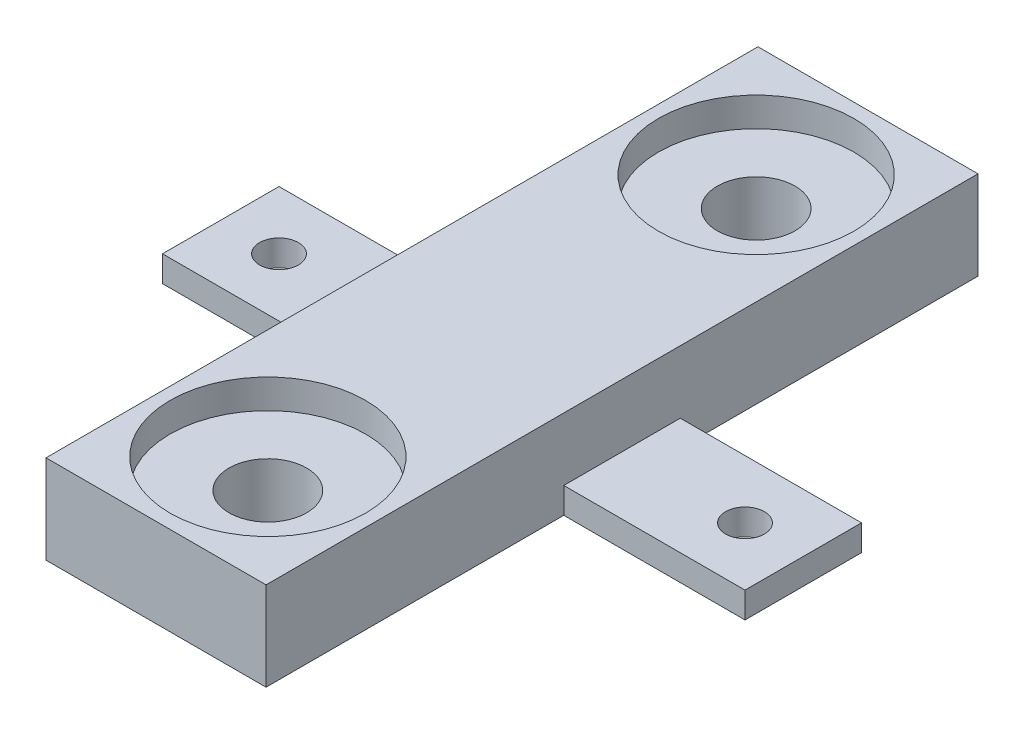
ISO-10303-21;
HEADER;
FILE_DESCRIPTION(('STEP AP214'),'2;1');
FILE_NAME('part.step','',(''),(''),'','','');
FILE_SCHEMA(('AUTOMOTIVE_DESIGN { 1 0 10303 214 1 1 1 1 }'));
ENDSEC;
DATA;
#1=APPLICATION_CONTEXT('core data for automotive mechanical design processes');
#2=APPLICATION_PROTOCOL_DEFINITION('international standard','automotive_design',2000,#1);
#3=PRODUCT_CONTEXT('',#1,'mechanical');
#4=PRODUCT('Part','Part','',(#3));
#5=PRODUCT_RELATED_PRODUCT_CATEGORY('part','',(#4));
#6=PRODUCT_DEFINITION_FORMATION('','',#4);
#7=PRODUCT_DEFINITION_CONTEXT('part definition',#1,'design');
#8=PRODUCT_DEFINITION('design','',#6,#7);
#9=PRODUCT_DEFINITION_SHAPE('','',#8);
#10=(LENGTH_UNIT() NAMED_UNIT(*) SI_UNIT(.MILLI.,.METRE.));
#11=(NAMED_UNIT(*) PLANE_ANGLE_UNIT() SI_UNIT($,.RADIAN.));
#12=(NAMED_UNIT(*) SI_UNIT($,.STERADIAN.) SOLID_ANGLE_UNIT());
#13=UNCERTAINTY_MEASURE_WITH_UNIT(LENGTH_MEASURE(1.E-05),#10,'distance_accuracy_value','');
#14=(GEOMETRIC_REPRESENTATION_CONTEXT(3) GLOBAL_UNCERTAINTY_ASSIGNED_CONTEXT((#13)) GLOBAL_UNIT_ASSIGNED_CONTEXT((#10,
#11,#12)) REPRESENTATION_CONTEXT('',''));
#15=CARTESIAN_POINT('',(0.,0.,0.));
#16=DIRECTION('',(0.,0.,1.));
#17=DIRECTION('',(1.,0.,0.));
#18=AXIS2_PLACEMENT_3D('',#15,#16,#17);
#19=CARTESIAN_POINT('',(0.,2.,0.));
#20=DIRECTION('',(0.,1.,0.));
#21=DIRECTION('',(0.,0.,1.));
#22=AXIS2_PLACEMENT_3D('',#19,#20,#21);
#23=PLANE('',#22);
#24=CARTESIAN_POINT('',(-18.,2.,0.));
#25=DIRECTION('',(0.,1.,0.));
#26=DIRECTION('',(0.,0.,1.));
#27=AXIS2_PLACEMENT_3D('',#24,#25,#26);
#28=CIRCLE('',#27,1.5);
#29=CARTESIAN_POINT('',(-18.,2.,1.5));
#30=VERTEX_POINT('',#29);
#31=EDGE_CURVE('E169',#30,#30,#28,.T.);
#32=ORIENTED_EDGE('',*,*,#31,.F.);
#33=EDGE_LOOP('',(#32));
#34=FACE_BOUND('',#33,.T.);
#35=DIRECTION('',(-1.,0.,0.));
#36=VECTOR('',#35,1.);
#37=CARTESIAN_POINT('',(0.,2.,4.49999999999999));
#38=LINE('',#37,#36);
#39=CARTESIAN_POINT('',(-8.5,2.,4.5));
#40=VERTEX_POINT('',#39);
#41=CARTESIAN_POINT('',(-22.5,2.,4.5));
#42=VERTEX_POINT('',#41);
#43=EDGE_CURVE('E155',#40,#42,#38,.T.);
#44=ORIENTED_EDGE('',*,*,#43,.F.);
#45=DIRECTION('',(0.,0.,-1.));
#46=VECTOR('',#45,1.);
#47=CARTESIAN_POINT('',(-8.5,2.,0.));
#48=LINE('',#47,#46);
#49=CARTESIAN_POINT('',(-8.5,2.,-4.5));
#50=VERTEX_POINT('',#49);
#51=EDGE_CURVE('E255',#40,#50,#48,.T.);
#52=ORIENTED_EDGE('',*,*,#51,.T.);
#53=DIRECTION('',(-1.,0.,0.));
#54=VECTOR('',#53,1.);
#55=CARTESIAN_POINT('',(0.,2.,-4.49999999999999));
#56=LINE('',#55,#54);
#57=CARTESIAN_POINT('',(-22.5,2.,-4.5));
#58=VERTEX_POINT('',#57);
#59=EDGE_CURVE('E138',#50,#58,#56,.T.);
#60=ORIENTED_EDGE('',*,*,#59,.T.);
#61=DIRECTION('',(0.,0.,1.));
#62=VECTOR('',#61,1.);
#63=CARTESIAN_POINT('',(-22.5,2.,0.));
#64=LINE('',#63,#62);
#65=EDGE_CURVE('E269',#58,#42,#64,.T.);
#66=ORIENTED_EDGE('',*,*,#65,.T.);
#67=EDGE_LOOP('',(#44,#52,#60,#66));
#68=FACE_BOUND('',#67,.T.);
#69=ADVANCED_FACE('F64',(#34,#68),#23,.T.);
#70=CARTESIAN_POINT('',(0.,2.,-27.5));
#71=DIRECTION('',(0.,0.,-1.));
#72=DIRECTION('',(-1.,0.,0.));
#73=AXIS2_PLACEMENT_3D('',#70,#71,#72);
#74=PLANE('',#73);
#75=DIRECTION('',(1.,0.,0.));
#76=VECTOR('',#75,1.);
#77=CARTESIAN_POINT('',(0.,0.,-27.5));
#78=LINE('',#77,#76);
#79=CARTESIAN_POINT('',(-8.5,0.,-27.5));
#80=VERTEX_POINT('',#79);
#81=CARTESIAN_POINT('',(8.5,0.,-27.5));
#82=VERTEX_POINT('',#81);
#83=EDGE_CURVE('E180',#80,#82,#78,.T.);
#84=ORIENTED_EDGE('',*,*,#83,.F.);
#85=DIRECTION('',(0.,-1.,0.));
#86=VECTOR('',#85,1.);
#87=CARTESIAN_POINT('',(-8.5,2.,-27.5));
#88=LINE('',#87,#86);
#89=CARTESIAN_POINT('',(-8.5,6.85,-27.5));
#90=VERTEX_POINT('',#89);
#91=EDGE_CURVE('E229',#90,#80,#88,.T.);
#92=ORIENTED_EDGE('',*,*,#91,.F.);
#93=DIRECTION('',(1.,0.,0.));
#94=VECTOR('',#93,1.);
#95=CARTESIAN_POINT('',(0.,6.85,-27.5));
#96=LINE('',#95,#94);
#97=CARTESIAN_POINT('',(8.5,6.85,-27.5));
#98=VERTEX_POINT('',#97);
#99=EDGE_CURVE('E261',#90,#98,#96,.T.);
#100=ORIENTED_EDGE('',*,*,#99,.T.);
#101=DIRECTION('',(0.,-1.,0.));
#102=VECTOR('',#101,1.);
#103=CARTESIAN_POINT('',(8.5,2.,-27.5));
#104=LINE('',#103,#102);
#105=EDGE_CURVE('E231',#98,#82,#104,.T.);
#106=ORIENTED_EDGE('',*,*,#105,.T.);
#107=EDGE_LOOP('',(#84,#92,#100,#106));
#108=FACE_BOUND('',#107,.T.);
#109=ADVANCED_FACE('F66',(#108),#74,.T.);
#110=CARTESIAN_POINT('',(0.,2.,-4.49999999999999));
#111=DIRECTION('',(0.,0.,1.));
#112=DIRECTION('',(1.,0.,0.));
#113=AXIS2_PLACEMENT_3D('',#110,#111,#112);
#114=PLANE('',#113);
#115=DIRECTION('',(-1.,0.,0.));
#116=VECTOR('',#115,1.);
#117=CARTESIAN_POINT('',(0.,0.,-4.49999999999999));
#118=LINE('',#117,#116);
#119=CARTESIAN_POINT('',(-8.5,0.,-4.5));
#120=VERTEX_POINT('',#119);
#121=CARTESIAN_POINT('',(-22.5,0.,-4.5));
#122=VERTEX_POINT('',#121);
#123=EDGE_CURVE('E187',#120,#122,#118,.T.);
#124=ORIENTED_EDGE('',*,*,#123,.T.);
#125=DIRECTION('',(0.,-1.,0.));
#126=VECTOR('',#125,1.);
#127=CARTESIAN_POINT('',(-22.5,2.,-4.5));
#128=LINE('',#127,#126);
#129=EDGE_CURVE('E223',#58,#122,#128,.T.);
#130=ORIENTED_EDGE('',*,*,#129,.F.);
#131=ORIENTED_EDGE('',*,*,#59,.F.);
#132=DIRECTION('',(0.,-1.,0.));
#133=VECTOR('',#132,1.);
#134=CARTESIAN_POINT('',(-8.5,2.,-4.5));
#135=LINE('',#134,#133);
#136=EDGE_CURVE('E226',#50,#120,#135,.T.);
#137=ORIENTED_EDGE('',*,*,#136,.T.);
#138=EDGE_LOOP('',(#124,#130,#131,#137));
#139=FACE_BOUND('',#138,.T.);
#140=ADVANCED_FACE('F336',(#139),#114,.F.);
#141=CARTESIAN_POINT('',(-22.5,2.,0.));
#142=DIRECTION('',(1.,0.,0.));
#143=DIRECTION('',(0.,0.,-1.));
#144=AXIS2_PLACEMENT_3D('',#141,#142,#143);
#145=PLANE('',#144);
#146=DIRECTION('',(0.,0.,1.));
#147=VECTOR('',#146,1.);
#148=CARTESIAN_POINT('',(-22.5,0.,0.));
#149=LINE('',#148,#147);
#150=CARTESIAN_POINT('',(-22.5,0.,4.5));
#151=VERTEX_POINT('',#150);
#152=EDGE_CURVE('E190',#122,#151,#149,.T.);
#153=ORIENTED_EDGE('',*,*,#152,.T.);
#154=DIRECTION('',(0.,-1.,0.));
#155=VECTOR('',#154,1.);
#156=CARTESIAN_POINT('',(-22.5,2.,4.5));
#157=LINE('',#156,#155);
#158=EDGE_CURVE('E221',#42,#151,#157,.T.);
#159=ORIENTED_EDGE('',*,*,#158,.F.);
#160=ORIENTED_EDGE('',*,*,#65,.F.);
#161=ORIENTED_EDGE('',*,*,#129,.T.);
#162=EDGE_LOOP('',(#153,#159,#160,#161));
#163=FACE_BOUND('',#162,.T.);
#164=ADVANCED_FACE('F490',(#163),#145,.F.);
#165=CARTESIAN_POINT('',(0.,2.,4.49999999999999));
#166=DIRECTION('',(0.,0.,1.));
#167=DIRECTION('',(1.,0.,0.));
#168=AXIS2_PLACEMENT_3D('',#165,#166,#167);
#169=PLANE('',#168);
#170=DIRECTION('',(-1.,0.,0.));
#171=VECTOR('',#170,1.);
#172=CARTESIAN_POINT('',(0.,0.,4.49999999999999));
#173=LINE('',#172,#171);
#174=CARTESIAN_POINT('',(-8.5,0.,4.49999999999999));
#175=VERTEX_POINT('',#174);
#176=EDGE_CURVE('E193',#175,#151,#173,.T.);
#177=ORIENTED_EDGE('',*,*,#176,.F.);
#178=DIRECTION('',(0.,-1.,0.));
#179=VECTOR('',#178,1.);
#180=CARTESIAN_POINT('',(-8.5,2.,4.49999999999999));
#181=LINE('',#180,#179);
#182=EDGE_CURVE('E219',#40,#175,#181,.T.);
#183=ORIENTED_EDGE('',*,*,#182,.F.);
#184=ORIENTED_EDGE('',*,*,#43,.T.);
#185=ORIENTED_EDGE('',*,*,#158,.T.);
#186=EDGE_LOOP('',(#177,#183,#184,#185));
#187=FACE_BOUND('',#186,.T.);
#188=ADVANCED_FACE('F275',(#187),#169,.T.);
#189=CARTESIAN_POINT('',(-8.5,2.,0.));
#190=DIRECTION('',(1.,0.,0.));
#191=DIRECTION('',(0.,0.,-1.));
#192=AXIS2_PLACEMENT_3D('',#189,#190,#191);
#193=PLANE('',#192);
#194=DIRECTION('',(0.,0.,1.));
#195=VECTOR('',#194,1.);
#196=CARTESIAN_POINT('',(-8.5,0.,0.));
#197=LINE('',#196,#195);
#198=CARTESIAN_POINT('',(-8.49999999999999,0.,27.5));
#199=VERTEX_POINT('',#198);
#200=EDGE_CURVE('E188',#175,#199,#197,.T.);
#201=ORIENTED_EDGE('',*,*,#200,.T.);
#202=DIRECTION('',(0.,-1.,0.));
#203=VECTOR('',#202,1.);
#204=CARTESIAN_POINT('',(-8.49999999999999,2.,27.5));
#205=LINE('',#204,#203);
#206=CARTESIAN_POINT('',(-8.49999999999999,6.85,27.5));
#207=VERTEX_POINT('',#206);
#208=EDGE_CURVE('E216',#207,#199,#205,.T.);
#209=ORIENTED_EDGE('',*,*,#208,.F.);
#210=DIRECTION('',(0.,0.,1.));
#211=VECTOR('',#210,1.);
#212=CARTESIAN_POINT('',(-8.5,6.85,0.));
#213=LINE('',#212,#211);
#214=EDGE_CURVE('E181',#90,#207,#213,.T.);
#215=ORIENTED_EDGE('',*,*,#214,.F.);
#216=ORIENTED_EDGE('',*,*,#91,.T.);
#217=EDGE_CURVE('E185',#80,#120,#197,.T.);
#218=ORIENTED_EDGE('',*,*,#217,.T.);
#219=ORIENTED_EDGE('',*,*,#136,.F.);
#220=ORIENTED_EDGE('',*,*,#51,.F.);
#221=ORIENTED_EDGE('',*,*,#182,.T.);
#222=EDGE_LOOP('',(#201,#209,#215,#216,#218,#219,#220,#221));
#223=FACE_BOUND('',#222,.T.);
#224=ADVANCED_FACE('F311',(#223),#193,.F.);
#225=CARTESIAN_POINT('',(0.,2.,27.5));
#226=DIRECTION('',(0.,0.,-1.));
#227=DIRECTION('',(-1.,0.,0.));
#228=AXIS2_PLACEMENT_3D('',#225,#226,#227);
#229=PLANE('',#228);
#230=DIRECTION('',(1.,0.,0.));
#231=VECTOR('',#230,1.);
#232=CARTESIAN_POINT('',(0.,0.,27.5));
#233=LINE('',#232,#231);
#234=CARTESIAN_POINT('',(8.5,0.,27.5));
#235=VERTEX_POINT('',#234);
#236=EDGE_CURVE('E196',#199,#235,#233,.T.);
#237=ORIENTED_EDGE('',*,*,#236,.T.);
#238=DIRECTION('',(0.,-1.,0.));
#239=VECTOR('',#238,1.);
#240=CARTESIAN_POINT('',(8.5,2.,27.5));
#241=LINE('',#240,#239);
#242=CARTESIAN_POINT('',(8.5,6.85,27.5));
#243=VERTEX_POINT('',#242);
#244=EDGE_CURVE('E214',#243,#235,#241,.T.);
#245=ORIENTED_EDGE('',*,*,#244,.F.);
#246=DIRECTION('',(1.,0.,0.));
#247=VECTOR('',#246,1.);
#248=CARTESIAN_POINT('',(0.,6.85,27.5));
#249=LINE('',#248,#247);
#250=EDGE_CURVE('E252',#207,#243,#249,.T.);
#251=ORIENTED_EDGE('',*,*,#250,.F.);
#252=ORIENTED_EDGE('',*,*,#208,.T.);
#253=EDGE_LOOP('',(#237,#245,#251,#252));
#254=FACE_BOUND('',#253,.T.);
#255=ADVANCED_FACE('F298',(#254),#229,.F.);
#256=CARTESIAN_POINT('',(8.5,2.,0.));
#257=DIRECTION('',(1.,0.,0.));
#258=DIRECTION('',(0.,0.,-1.));
#259=AXIS2_PLACEMENT_3D('',#256,#257,#258);
#260=PLANE('',#259);
#261=DIRECTION('',(0.,0.,1.));
#262=VECTOR('',#261,1.);
#263=CARTESIAN_POINT('',(8.5,0.,0.));
#264=LINE('',#263,#262);
#265=CARTESIAN_POINT('',(8.5,0.,4.5));
#266=VERTEX_POINT('',#265);
#267=EDGE_CURVE('E182',#266,#235,#264,.T.);
#268=ORIENTED_EDGE('',*,*,#267,.F.);
#269=DIRECTION('',(0.,-1.,0.));
#270=VECTOR('',#269,1.);
#271=CARTESIAN_POINT('',(8.5,2.,4.5));
#272=LINE('',#271,#270);
#273=CARTESIAN_POINT('',(8.5,2.,4.49999999999999));
#274=VERTEX_POINT('',#273);
#275=EDGE_CURVE('E164',#274,#266,#272,.T.);
#276=ORIENTED_EDGE('',*,*,#275,.F.);
#277=DIRECTION('',(0.,0.,-1.));
#278=VECTOR('',#277,1.);
#279=CARTESIAN_POINT('',(8.5,2.,0.));
#280=LINE('',#279,#278);
#281=CARTESIAN_POINT('',(8.5,2.,-4.5));
#282=VERTEX_POINT('',#281);
#283=EDGE_CURVE('E83',#274,#282,#280,.T.);
#284=ORIENTED_EDGE('',*,*,#283,.T.);
#285=DIRECTION('',(0.,-1.,0.));
#286=VECTOR('',#285,1.);
#287=CARTESIAN_POINT('',(8.5,2.,-4.5));
#288=LINE('',#287,#286);
#289=CARTESIAN_POINT('',(8.5,0.,-4.5));
#290=VERTEX_POINT('',#289);
#291=EDGE_CURVE('E129',#282,#290,#288,.T.);
#292=ORIENTED_EDGE('',*,*,#291,.T.);
#293=EDGE_CURVE('E178',#82,#290,#264,.T.);
#294=ORIENTED_EDGE('',*,*,#293,.F.);
#295=ORIENTED_EDGE('',*,*,#105,.F.);
#296=DIRECTION('',(0.,0.,1.));
#297=VECTOR('',#296,1.);
#298=CARTESIAN_POINT('',(8.5,6.85,0.));
#299=LINE('',#298,#297);
#300=EDGE_CURVE('E258',#98,#243,#299,.T.);
#301=ORIENTED_EDGE('',*,*,#300,.T.);
#302=ORIENTED_EDGE('',*,*,#244,.T.);
#303=EDGE_LOOP('',(#268,#276,#284,#292,#294,#295,#301,#302));
#304=FACE_BOUND('',#303,.T.);
#305=ADVANCED_FACE('F307',(#304),#260,.T.);
#306=CARTESIAN_POINT('',(0.,2.,4.5));
#307=DIRECTION('',(0.,0.,-1.));
#308=DIRECTION('',(-1.,0.,0.));
#309=AXIS2_PLACEMENT_3D('',#306,#307,#308);
#310=PLANE('',#309);
#311=DIRECTION('',(1.,0.,0.));
#312=VECTOR('',#311,1.);
#313=CARTESIAN_POINT('',(0.,0.,4.5));
#314=LINE('',#313,#312);
#315=CARTESIAN_POINT('',(22.5,0.,4.49999999999999));
#316=VERTEX_POINT('',#315);
#317=EDGE_CURVE('E161',#266,#316,#314,.T.);
#318=ORIENTED_EDGE('',*,*,#317,.T.);
#319=DIRECTION('',(0.,-1.,0.));
#320=VECTOR('',#319,1.);
#321=CARTESIAN_POINT('',(22.5,2.,4.49999999999999));
#322=LINE('',#321,#320);
#323=CARTESIAN_POINT('',(22.5,2.,4.49999999999999));
#324=VERTEX_POINT('',#323);
#325=EDGE_CURVE('E158',#324,#316,#322,.T.);
#326=ORIENTED_EDGE('',*,*,#325,.F.);
#327=DIRECTION('',(1.,0.,0.));
#328=VECTOR('',#327,1.);
#329=CARTESIAN_POINT('',(0.,2.,4.5));
#330=LINE('',#329,#328);
#331=EDGE_CURVE('E147',#274,#324,#330,.T.);
#332=ORIENTED_EDGE('',*,*,#331,.F.);
#333=ORIENTED_EDGE('',*,*,#275,.T.);
#334=EDGE_LOOP('',(#318,#326,#332,#333));
#335=FACE_BOUND('',#334,.T.);
#336=ADVANCED_FACE('F159',(#335),#310,.F.);
#337=CARTESIAN_POINT('',(22.5,2.,0.));
#338=DIRECTION('',(1.,0.,0.));
#339=DIRECTION('',(0.,0.,-1.));
#340=AXIS2_PLACEMENT_3D('',#337,#338,#339);
#341=PLANE('',#340);
#342=DIRECTION('',(0.,0.,1.));
#343=VECTOR('',#342,1.);
#344=CARTESIAN_POINT('',(22.5,0.,0.));
#345=LINE('',#344,#343);
#346=CARTESIAN_POINT('',(22.5,0.,-4.50000000000001));
#347=VERTEX_POINT('',#346);
#348=EDGE_CURVE('E200',#347,#316,#345,.T.);
#349=ORIENTED_EDGE('',*,*,#348,.F.);
#350=DIRECTION('',(0.,-1.,0.));
#351=VECTOR('',#350,1.);
#352=CARTESIAN_POINT('',(22.5,2.,-4.50000000000001));
#353=LINE('',#352,#351);
#354=CARTESIAN_POINT('',(22.5,2.,-4.50000000000001));
#355=VERTEX_POINT('',#354);
#356=EDGE_CURVE('E125',#355,#347,#353,.T.);
#357=ORIENTED_EDGE('',*,*,#356,.F.);
#358=DIRECTION('',(0.,0.,1.));
#359=VECTOR('',#358,1.);
#360=CARTESIAN_POINT('',(22.5,2.,0.));
#361=LINE('',#360,#359);
#362=EDGE_CURVE('E153',#355,#324,#361,.T.);
#363=ORIENTED_EDGE('',*,*,#362,.T.);
#364=ORIENTED_EDGE('',*,*,#325,.T.);
#365=EDGE_LOOP('',(#349,#357,#363,#364));
#366=FACE_BOUND('',#365,.T.);
#367=ADVANCED_FACE('F166',(#366),#341,.T.);
#368=CARTESIAN_POINT('',(-18.,2.,0.));
#369=DIRECTION('',(0.,-1.,0.));
#370=DIRECTION('',(0.,0.,-1.));
#371=AXIS2_PLACEMENT_3D('',#368,#369,#370);
#372=CYLINDRICAL_SURFACE('',#371,1.5);
#373=ORIENTED_EDGE('',*,*,#31,.T.);
#374=EDGE_LOOP('',(#373));
#375=FACE_BOUND('',#374,.T.);
#376=CARTESIAN_POINT('',(-18.,0.,0.));
#377=DIRECTION('',(0.,1.,0.));
#378=DIRECTION('',(0.,0.,1.));
#379=AXIS2_PLACEMENT_3D('',#376,#377,#378);
#380=CIRCLE('',#379,1.5);
#381=CARTESIAN_POINT('',(-18.,0.,1.5));
#382=VERTEX_POINT('',#381);
#383=EDGE_CURVE('E205',#382,#382,#380,.T.);
#384=ORIENTED_EDGE('',*,*,#383,.F.);
#385=EDGE_LOOP('',(#384));
#386=FACE_BOUND('',#385,.T.);
#387=ADVANCED_FACE('F319',(#375,#386),#372,.F.);
#388=CARTESIAN_POINT('',(0.,2.,-4.49999999999999));
#389=DIRECTION('',(0.,0.,-1.));
#390=DIRECTION('',(-1.,0.,0.));
#391=AXIS2_PLACEMENT_3D('',#388,#389,#390);
#392=PLANE('',#391);
#393=DIRECTION('',(1.,0.,0.));
#394=VECTOR('',#393,1.);
#395=CARTESIAN_POINT('',(0.,0.,-4.49999999999999));
#396=LINE('',#395,#394);
#397=EDGE_CURVE('E202',#290,#347,#396,.T.);
#398=ORIENTED_EDGE('',*,*,#397,.F.);
#399=ORIENTED_EDGE('',*,*,#291,.F.);
#400=DIRECTION('',(1.,0.,0.));
#401=VECTOR('',#400,1.);
#402=CARTESIAN_POINT('',(0.,2.,-4.49999999999999));
#403=LINE('',#402,#401);
#404=EDGE_CURVE('E167',#282,#355,#403,.T.);
#405=ORIENTED_EDGE('',*,*,#404,.T.);
#406=ORIENTED_EDGE('',*,*,#356,.T.);
#407=EDGE_LOOP('',(#398,#399,#405,#406));
#408=FACE_BOUND('',#407,.T.);
#409=ADVANCED_FACE('F316',(#408),#392,.T.);
#410=CARTESIAN_POINT('',(18.,2.,0.));
#411=DIRECTION('',(0.,-1.,0.));
#412=DIRECTION('',(0.,0.,-1.));
#413=AXIS2_PLACEMENT_3D('',#410,#411,#412);
#414=CYLINDRICAL_SURFACE('',#413,1.5);
#415=CARTESIAN_POINT('',(18.,2.,0.));
#416=DIRECTION('',(0.,1.,0.));
#417=DIRECTION('',(0.,0.,1.));
#418=AXIS2_PLACEMENT_3D('',#415,#416,#417);
#419=CIRCLE('',#418,1.5);
#420=CARTESIAN_POINT('',(18.,2.,1.49999999999999));
#421=VERTEX_POINT('',#420);
#422=EDGE_CURVE('E175',#421,#421,#419,.T.);
#423=ORIENTED_EDGE('',*,*,#422,.T.);
#424=EDGE_LOOP('',(#423));
#425=FACE_BOUND('',#424,.T.);
#426=CARTESIAN_POINT('',(18.,0.,0.));
#427=DIRECTION('',(0.,1.,0.));
#428=DIRECTION('',(0.,0.,1.));
#429=AXIS2_PLACEMENT_3D('',#426,#427,#428);
#430=CIRCLE('',#429,1.5);
#431=CARTESIAN_POINT('',(18.,0.,1.49999999999999));
#432=VERTEX_POINT('',#431);
#433=EDGE_CURVE('E208',#432,#432,#430,.T.);
#434=ORIENTED_EDGE('',*,*,#433,.F.);
#435=EDGE_LOOP('',(#434));
#436=FACE_BOUND('',#435,.T.);
#437=ADVANCED_FACE('F318',(#425,#436),#414,.F.);
#438=ORIENTED_EDGE('',*,*,#283,.F.);
#439=ORIENTED_EDGE('',*,*,#331,.T.);
#440=ORIENTED_EDGE('',*,*,#362,.F.);
#441=ORIENTED_EDGE('',*,*,#404,.F.);
#442=EDGE_LOOP('',(#438,#439,#440,#441));
#443=FACE_BOUND('',#442,.T.);
#444=ORIENTED_EDGE('',*,*,#422,.F.);
#445=EDGE_LOOP('',(#444));
#446=FACE_BOUND('',#445,.T.);
#447=ADVANCED_FACE('F149',(#443,#446),#23,.T.);
#448=CARTESIAN_POINT('',(0.,0.,0.));
#449=DIRECTION('',(0.,1.,0.));
#450=DIRECTION('',(0.,0.,1.));
#451=AXIS2_PLACEMENT_3D('',#448,#449,#450);
#452=PLANE('',#451);
#453=CARTESIAN_POINT('',(0.,0.,-18.8625));
#454=DIRECTION('',(0.,-1.,0.));
#455=DIRECTION('',(0.,0.,-1.));
#456=AXIS2_PLACEMENT_3D('',#453,#454,#455);
#457=CIRCLE('',#456,3.);
#458=CARTESIAN_POINT('',(0.,0.,-21.8625));
#459=VERTEX_POINT('',#458);
#460=EDGE_CURVE('E234',#459,#459,#457,.T.);
#461=ORIENTED_EDGE('',*,*,#460,.F.);
#462=EDGE_LOOP('',(#461));
#463=FACE_BOUND('',#462,.T.);
#464=CARTESIAN_POINT('',(0.,0.,18.8625));
#465=DIRECTION('',(0.,-1.,0.));
#466=DIRECTION('',(0.,0.,-1.));
#467=AXIS2_PLACEMENT_3D('',#464,#465,#466);
#468=CIRCLE('',#467,3.);
#469=CARTESIAN_POINT('',(0.,0.,15.8625));
#470=VERTEX_POINT('',#469);
#471=EDGE_CURVE('E240',#470,#470,#468,.T.);
#472=ORIENTED_EDGE('',*,*,#471,.F.);
#473=EDGE_LOOP('',(#472));
#474=FACE_BOUND('',#473,.T.);
#475=ORIENTED_EDGE('',*,*,#293,.T.);
#476=ORIENTED_EDGE('',*,*,#397,.T.);
#477=ORIENTED_EDGE('',*,*,#348,.T.);
#478=ORIENTED_EDGE('',*,*,#317,.F.);
#479=ORIENTED_EDGE('',*,*,#267,.T.);
#480=ORIENTED_EDGE('',*,*,#236,.F.);
#481=ORIENTED_EDGE('',*,*,#200,.F.);
#482=ORIENTED_EDGE('',*,*,#176,.T.);
#483=ORIENTED_EDGE('',*,*,#152,.F.);
#484=ORIENTED_EDGE('',*,*,#123,.F.);
#485=ORIENTED_EDGE('',*,*,#217,.F.);
#486=ORIENTED_EDGE('',*,*,#83,.T.);
#487=EDGE_LOOP('',(#475,#476,#477,#478,#479,#480,#481,#482,#483,#484,#485,#486));
#488=FACE_BOUND('',#487,.T.);
#489=ORIENTED_EDGE('',*,*,#383,.T.);
#490=EDGE_LOOP('',(#489));
#491=FACE_BOUND('',#490,.T.);
#492=ORIENTED_EDGE('',*,*,#433,.T.);
#493=EDGE_LOOP('',(#492));
#494=FACE_BOUND('',#493,.T.);
#495=ADVANCED_FACE('F314',(#463,#474,#488,#491,#494),#452,.F.);
#496=CARTESIAN_POINT('',(0.,6.85,0.));
#497=DIRECTION('',(0.,-1.,0.));
#498=DIRECTION('',(0.,0.,-1.));
#499=AXIS2_PLACEMENT_3D('',#496,#497,#498);
#500=PLANE('',#499);
#501=CARTESIAN_POINT('',(0.,6.85,18.8625));
#502=DIRECTION('',(0.,-1.,0.));
#503=DIRECTION('',(0.,0.,-1.));
#504=AXIS2_PLACEMENT_3D('',#501,#502,#503);
#505=CIRCLE('',#504,7.55);
#506=CARTESIAN_POINT('',(0.,6.85,11.3125));
#507=VERTEX_POINT('',#506);
#508=EDGE_CURVE('E238',#507,#507,#505,.T.);
#509=ORIENTED_EDGE('',*,*,#508,.T.);
#510=EDGE_LOOP('',(#509));
#511=FACE_BOUND('',#510,.T.);
#512=CARTESIAN_POINT('',(0.,6.85,-18.8625));
#513=DIRECTION('',(0.,-1.,0.));
#514=DIRECTION('',(0.,0.,-1.));
#515=AXIS2_PLACEMENT_3D('',#512,#513,#514);
#516=CIRCLE('',#515,7.55);
#517=CARTESIAN_POINT('',(0.,6.85,-26.4125));
#518=VERTEX_POINT('',#517);
#519=EDGE_CURVE('E248',#518,#518,#516,.T.);
#520=ORIENTED_EDGE('',*,*,#519,.T.);
#521=EDGE_LOOP('',(#520));
#522=FACE_BOUND('',#521,.T.);
#523=ORIENTED_EDGE('',*,*,#250,.T.);
#524=ORIENTED_EDGE('',*,*,#300,.F.);
#525=ORIENTED_EDGE('',*,*,#99,.F.);
#526=ORIENTED_EDGE('',*,*,#214,.T.);
#527=EDGE_LOOP('',(#523,#524,#525,#526));
#528=FACE_BOUND('',#527,.T.);
#529=ADVANCED_FACE('F304',(#511,#522,#528),#500,.F.);
#530=CARTESIAN_POINT('',(0.,6.85,-18.8625));
#531=DIRECTION('',(0.,-1.,0.));
#532=DIRECTION('',(0.,0.,-1.));
#533=AXIS2_PLACEMENT_3D('',#530,#531,#532);
#534=CYLINDRICAL_SURFACE('',#533,7.55);
#535=ORIENTED_EDGE('',*,*,#519,.F.);
#536=EDGE_LOOP('',(#535));
#537=FACE_BOUND('',#536,.T.);
#538=CARTESIAN_POINT('',(0.,4.6,-18.8625));
#539=DIRECTION('',(0.,-1.,0.));
#540=DIRECTION('',(0.,0.,-1.));
#541=AXIS2_PLACEMENT_3D('',#538,#539,#540);
#542=CIRCLE('',#541,7.55);
#543=CARTESIAN_POINT('',(0.,4.6,-26.4125));
#544=VERTEX_POINT('',#543);
#545=EDGE_CURVE('E74',#544,#544,#542,.T.);
#546=ORIENTED_EDGE('',*,*,#545,.T.);
#547=EDGE_LOOP('',(#546));
#548=FACE_BOUND('',#547,.T.);
#549=ADVANCED_FACE('F348',(#537,#548),#534,.F.);
#550=CARTESIAN_POINT('',(0.,6.85,18.8625));
#551=DIRECTION('',(0.,-1.,0.));
#552=DIRECTION('',(0.,0.,-1.));
#553=AXIS2_PLACEMENT_3D('',#550,#551,#552);
#554=CYLINDRICAL_SURFACE('',#553,7.55);
#555=ORIENTED_EDGE('',*,*,#508,.F.);
#556=EDGE_LOOP('',(#555));
#557=FACE_BOUND('',#556,.T.);
#558=CARTESIAN_POINT('',(0.,4.6,18.8625));
#559=DIRECTION('',(0.,-1.,0.));
#560=DIRECTION('',(0.,0.,-1.));
#561=AXIS2_PLACEMENT_3D('',#558,#559,#560);
#562=CIRCLE('',#561,7.55);
#563=CARTESIAN_POINT('',(0.,4.6,11.3125));
#564=VERTEX_POINT('',#563);
#565=EDGE_CURVE('E12',#564,#564,#562,.T.);
#566=ORIENTED_EDGE('',*,*,#565,.T.);
#567=EDGE_LOOP('',(#566));
#568=FACE_BOUND('',#567,.T.);
#569=ADVANCED_FACE('F367',(#557,#568),#554,.F.);
#570=CARTESIAN_POINT('',(0.,4.6,0.));
#571=DIRECTION('',(0.,-1.,0.));
#572=DIRECTION('',(0.,0.,-1.));
#573=AXIS2_PLACEMENT_3D('',#570,#571,#572);
#574=PLANE('',#573);
#575=CARTESIAN_POINT('',(0.,4.6,-18.8625));
#576=DIRECTION('',(0.,-1.,0.));
#577=DIRECTION('',(0.,0.,-1.));
#578=AXIS2_PLACEMENT_3D('',#575,#576,#577);
#579=CIRCLE('',#578,3.);
#580=CARTESIAN_POINT('',(0.,4.6,-21.8625));
#581=VERTEX_POINT('',#580);
#582=EDGE_CURVE('E68',#581,#581,#579,.T.);
#583=ORIENTED_EDGE('',*,*,#582,.T.);
#584=EDGE_LOOP('',(#583));
#585=FACE_BOUND('',#584,.T.);
#586=ORIENTED_EDGE('',*,*,#545,.F.);
#587=EDGE_LOOP('',(#586));
#588=FACE_BOUND('',#587,.T.);
#589=ADVANCED_FACE('F365',(#585,#588),#574,.F.);
#590=CARTESIAN_POINT('',(0.,4.6,18.8625));
#591=DIRECTION('',(0.,-1.,0.));
#592=DIRECTION('',(0.,0.,-1.));
#593=AXIS2_PLACEMENT_3D('',#590,#591,#592);
#594=CIRCLE('',#593,3.);
#595=CARTESIAN_POINT('',(0.,4.6,15.8625));
#596=VERTEX_POINT('',#595);
#597=EDGE_CURVE('E232',#596,#596,#594,.T.);
#598=ORIENTED_EDGE('',*,*,#597,.T.);
#599=EDGE_LOOP('',(#598));
#600=FACE_BOUND('',#599,.T.);
#601=ORIENTED_EDGE('',*,*,#565,.F.);
#602=EDGE_LOOP('',(#601));
#603=FACE_BOUND('',#602,.T.);
#604=ADVANCED_FACE('F358',(#600,#603),#574,.F.);
#605=CARTESIAN_POINT('',(0.,6.85,18.8625));
#606=DIRECTION('',(0.,-1.,0.));
#607=DIRECTION('',(0.,0.,-1.));
#608=AXIS2_PLACEMENT_3D('',#605,#606,#607);
#609=CYLINDRICAL_SURFACE('',#608,3.);
#610=CARTESIAN_POINT('',(0.,0.,15.8625));
#611=CARTESIAN_POINT('',(0.,0.0479166666666674,15.8625));
#612=CARTESIAN_POINT('',(0.,0.095833333333334,15.8625));
#613=CARTESIAN_POINT('',(0.,0.191666666666668,15.8625));
#614=CARTESIAN_POINT('',(0.,0.239583333333334,15.8625));
#615=CARTESIAN_POINT('',(0.,0.335416666666668,15.8625));
#616=CARTESIAN_POINT('',(0.,0.383333333333334,15.8625));
#617=CARTESIAN_POINT('',(0.,0.479166666666668,15.8625));
#618=CARTESIAN_POINT('',(0.,0.527083333333334,15.8625));
#619=CARTESIAN_POINT('',(0.,0.622916666666668,15.8625));
#620=CARTESIAN_POINT('',(0.,0.670833333333335,15.8625));
#621=CARTESIAN_POINT('',(0.,0.766666666666668,15.8625));
#622=CARTESIAN_POINT('',(0.,0.814583333333335,15.8625));
#623=CARTESIAN_POINT('',(0.,0.910416666666668,15.8625));
#624=CARTESIAN_POINT('',(0.,0.958333333333334,15.8625));
#625=CARTESIAN_POINT('',(0.,1.05416666666667,15.8625));
#626=CARTESIAN_POINT('',(0.,1.10208333333333,15.8625));
#627=CARTESIAN_POINT('',(0.,1.19791666666667,15.8625));
#628=CARTESIAN_POINT('',(0.,1.24583333333333,15.8625));
#629=CARTESIAN_POINT('',(0.,1.34166666666667,15.8625));
#630=CARTESIAN_POINT('',(0.,1.38958333333333,15.8625));
#631=CARTESIAN_POINT('',(0.,1.48541666666667,15.8625));
#632=CARTESIAN_POINT('',(0.,1.53333333333334,15.8625));
#633=CARTESIAN_POINT('',(0.,1.62916666666667,15.8625));
#634=CARTESIAN_POINT('',(0.,1.67708333333334,15.8625));
#635=CARTESIAN_POINT('',(0.,1.77291666666667,15.8625));
#636=CARTESIAN_POINT('',(0.,1.82083333333333,15.8625));
#637=CARTESIAN_POINT('',(0.,1.91666666666667,15.8625));
#638=CARTESIAN_POINT('',(0.,1.96458333333333,15.8625));
#639=CARTESIAN_POINT('',(0.,2.06041666666667,15.8625));
#640=CARTESIAN_POINT('',(0.,2.10833333333333,15.8625));
#641=CARTESIAN_POINT('',(0.,2.20416666666667,15.8625));
#642=CARTESIAN_POINT('',(0.,2.25208333333333,15.8625));
#643=CARTESIAN_POINT('',(0.,2.34791666666667,15.8625));
#644=CARTESIAN_POINT('',(0.,2.39583333333334,15.8625));
#645=CARTESIAN_POINT('',(0.,2.49166666666667,15.8625));
#646=CARTESIAN_POINT('',(0.,2.53958333333334,15.8625));
#647=CARTESIAN_POINT('',(0.,2.63541666666667,15.8625));
#648=CARTESIAN_POINT('',(0.,2.68333333333334,15.8625));
#649=CARTESIAN_POINT('',(0.,2.77916666666667,15.8625));
#650=CARTESIAN_POINT('',(0.,2.82708333333334,15.8625));
#651=CARTESIAN_POINT('',(0.,2.92291666666667,15.8625));
#652=CARTESIAN_POINT('',(0.,2.97083333333333,15.8625));
#653=CARTESIAN_POINT('',(0.,3.06666666666667,15.8625));
#654=CARTESIAN_POINT('',(0.,3.11458333333334,15.8625));
#655=CARTESIAN_POINT('',(0.,3.21041666666667,15.8625));
#656=CARTESIAN_POINT('',(0.,3.25833333333334,15.8625));
#657=CARTESIAN_POINT('',(0.,3.35416666666667,15.8625));
#658=CARTESIAN_POINT('',(0.,3.40208333333333,15.8625));
#659=CARTESIAN_POINT('',(0.,3.49791666666667,15.8625));
#660=CARTESIAN_POINT('',(0.,3.54583333333334,15.8625));
#661=CARTESIAN_POINT('',(0.,3.64166666666667,15.8625));
#662=CARTESIAN_POINT('',(0.,3.68958333333333,15.8625));
#663=CARTESIAN_POINT('',(0.,3.78541666666667,15.8625));
#664=CARTESIAN_POINT('',(0.,3.83333333333334,15.8625));
#665=CARTESIAN_POINT('',(0.,3.92916666666667,15.8625));
#666=CARTESIAN_POINT('',(0.,3.97708333333334,15.8625));
#667=CARTESIAN_POINT('',(0.,4.07291666666667,15.8625));
#668=CARTESIAN_POINT('',(0.,4.12083333333334,15.8625));
#669=CARTESIAN_POINT('',(0.,4.21666666666667,15.8625));
#670=CARTESIAN_POINT('',(0.,4.26458333333334,15.8625));
#671=CARTESIAN_POINT('',(0.,4.36041666666667,15.8625));
#672=CARTESIAN_POINT('',(0.,4.40833333333333,15.8625));
#673=CARTESIAN_POINT('',(0.,4.50416666666667,15.8625));
#674=CARTESIAN_POINT('',(0.,4.55208333333333,15.8625));
#675=CARTESIAN_POINT('',(0.,4.6,15.8625));
#676=B_SPLINE_CURVE_WITH_KNOTS('',3,(#610,#611,#612,#613,#614,#615,#616,#617,#618,#619,#620,
#621,#622,#623,#624,#625,#626,#627,#628,#629,#630,#631,#632,#633,#634,#635,#636,#637,#638,#639,
#640,#641,#642,#643,#644,#645,#646,#647,#648,#649,#650,#651,#652,#653,#654,#655,#656,#657,#658,
#659,#660,#661,#662,#663,#664,#665,#666,#667,#668,#669,#670,#671,#672,#673,#674,#675),
.UNSPECIFIED.,.F.,.F.,(4,2,2,2,2,2,2,2,2,2,2,2,2,2,2,2,2,2,2,2,2,2,2,2,2,2,2,2,2,2,2,2,4),(0.,
0.14375,0.2875,0.43125,0.575,0.718750000000001,0.8625,1.00625,1.15,1.29375,1.4375,1.58125,1.725,
1.86875,2.0125,2.15625,2.3,2.44375,2.5875,2.73125,2.875,3.01875,3.1625,3.30625,3.45,3.59375,
3.7375,3.88125,4.025,4.16875,4.3125,4.45625,4.6),.UNSPECIFIED.);
#677=EDGE_CURVE('BSEAM354',#470,#596,#676,.T.);
#678=ORIENTED_EDGE('',*,*,#471,.T.);
#679=ORIENTED_EDGE('',*,*,#597,.F.);
#680=ORIENTED_EDGE('',*,*,#677,.T.);
#681=ORIENTED_EDGE('',*,*,#677,.F.);
#682=EDGE_LOOP('',(#678,#680,#679,#681));
#683=FACE_BOUND('',#682,.T.);
#684=ADVANCED_FACE('F354',(#683),#609,.F.);
#685=CARTESIAN_POINT('',(0.,6.85,-18.8625));
#686=DIRECTION('',(0.,-1.,0.));
#687=DIRECTION('',(0.,0.,-1.));
#688=AXIS2_PLACEMENT_3D('',#685,#686,#687);
#689=CYLINDRICAL_SURFACE('',#688,3.);
#690=CARTESIAN_POINT('',(0.,0.,-21.8625));
#691=CARTESIAN_POINT('',(0.,0.0479166666666674,-21.8625));
#692=CARTESIAN_POINT('',(0.,0.095833333333334,-21.8625));
#693=CARTESIAN_POINT('',(0.,0.191666666666668,-21.8625));
#694=CARTESIAN_POINT('',(0.,0.239583333333334,-21.8625));
#695=CARTESIAN_POINT('',(0.,0.335416666666668,-21.8625));
#696=CARTESIAN_POINT('',(0.,0.383333333333334,-21.8625));
#697=CARTESIAN_POINT('',(0.,0.479166666666668,-21.8625));
#698=CARTESIAN_POINT('',(0.,0.527083333333334,-21.8625));
#699=CARTESIAN_POINT('',(0.,0.622916666666668,-21.8625));
#700=CARTESIAN_POINT('',(0.,0.670833333333335,-21.8625));
#701=CARTESIAN_POINT('',(0.,0.766666666666668,-21.8625));
#702=CARTESIAN_POINT('',(0.,0.814583333333335,-21.8625));
#703=CARTESIAN_POINT('',(0.,0.910416666666668,-21.8625));
#704=CARTESIAN_POINT('',(0.,0.958333333333334,-21.8625));
#705=CARTESIAN_POINT('',(0.,1.05416666666667,-21.8625));
#706=CARTESIAN_POINT('',(0.,1.10208333333333,-21.8625));
#707=CARTESIAN_POINT('',(0.,1.19791666666667,-21.8625));
#708=CARTESIAN_POINT('',(0.,1.24583333333333,-21.8625));
#709=CARTESIAN_POINT('',(0.,1.34166666666667,-21.8625));
#710=CARTESIAN_POINT('',(0.,1.38958333333333,-21.8625));
#711=CARTESIAN_POINT('',(0.,1.48541666666667,-21.8625));
#712=CARTESIAN_POINT('',(0.,1.53333333333334,-21.8625));
#713=CARTESIAN_POINT('',(0.,1.62916666666667,-21.8625));
#714=CARTESIAN_POINT('',(0.,1.67708333333334,-21.8625));
#715=CARTESIAN_POINT('',(0.,1.77291666666667,-21.8625));
#716=CARTESIAN_POINT('',(0.,1.82083333333333,-21.8625));
#717=CARTESIAN_POINT('',(0.,1.91666666666667,-21.8625));
#718=CARTESIAN_POINT('',(0.,1.96458333333333,-21.8625));
#719=CARTESIAN_POINT('',(0.,2.06041666666667,-21.8625));
#720=CARTESIAN_POINT('',(0.,2.10833333333333,-21.8625));
#721=CARTESIAN_POINT('',(0.,2.20416666666667,-21.8625));
#722=CARTESIAN_POINT('',(0.,2.25208333333333,-21.8625));
#723=CARTESIAN_POINT('',(0.,2.34791666666667,-21.8625));
#724=CARTESIAN_POINT('',(0.,2.39583333333334,-21.8625));
#725=CARTESIAN_POINT('',(0.,2.49166666666667,-21.8625));
#726=CARTESIAN_POINT('',(0.,2.53958333333334,-21.8625));
#727=CARTESIAN_POINT('',(0.,2.63541666666667,-21.8625));
#728=CARTESIAN_POINT('',(0.,2.68333333333334,-21.8625));
#729=CARTESIAN_POINT('',(0.,2.77916666666667,-21.8625));
#730=CARTESIAN_POINT('',(0.,2.82708333333334,-21.8625));
#731=CARTESIAN_POINT('',(0.,2.92291666666667,-21.8625));
#732=CARTESIAN_POINT('',(0.,2.97083333333333,-21.8625));
#733=CARTESIAN_POINT('',(0.,3.06666666666667,-21.8625));
#734=CARTESIAN_POINT('',(0.,3.11458333333334,-21.8625));
#735=CARTESIAN_POINT('',(0.,3.21041666666667,-21.8625));
#736=CARTESIAN_POINT('',(0.,3.25833333333334,-21.8625));
#737=CARTESIAN_POINT('',(0.,3.35416666666667,-21.8625));
#738=CARTESIAN_POINT('',(0.,3.40208333333333,-21.8625));
#739=CARTESIAN_POINT('',(0.,3.49791666666667,-21.8625));
#740=CARTESIAN_POINT('',(0.,3.54583333333334,-21.8625));
#741=CARTESIAN_POINT('',(0.,3.64166666666667,-21.8625));
#742=CARTESIAN_POINT('',(0.,3.68958333333333,-21.8625));
#743=CARTESIAN_POINT('',(0.,3.78541666666667,-21.8625));
#744=CARTESIAN_POINT('',(0.,3.83333333333334,-21.8625));
#745=CARTESIAN_POINT('',(0.,3.92916666666667,-21.8625));
#746=CARTESIAN_POINT('',(0.,3.97708333333334,-21.8625));
#747=CARTESIAN_POINT('',(0.,4.07291666666667,-21.8625));
#748=CARTESIAN_POINT('',(0.,4.12083333333334,-21.8625));
#749=CARTESIAN_POINT('',(0.,4.21666666666667,-21.8625));
#750=CARTESIAN_POINT('',(0.,4.26458333333334,-21.8625));
#751=CARTESIAN_POINT('',(0.,4.36041666666667,-21.8625));
#752=CARTESIAN_POINT('',(0.,4.40833333333333,-21.8625));
#753=CARTESIAN_POINT('',(0.,4.50416666666667,-21.8625));
#754=CARTESIAN_POINT('',(0.,4.55208333333333,-21.8625));
#755=CARTESIAN_POINT('',(0.,4.6,-21.8625));
#756=B_SPLINE_CURVE_WITH_KNOTS('',3,(#690,#691,#692,#693,#694,#695,#696,#697,#698,#699,#700,
#701,#702,#703,#704,#705,#706,#707,#708,#709,#710,#711,#712,#713,#714,#715,#716,#717,#718,#719,
#720,#721,#722,#723,#724,#725,#726,#727,#728,#729,#730,#731,#732,#733,#734,#735,#736,#737,#738,
#739,#740,#741,#742,#743,#744,#745,#746,#747,#748,#749,#750,#751,#752,#753,#754,#755),
.UNSPECIFIED.,.F.,.F.,(4,2,2,2,2,2,2,2,2,2,2,2,2,2,2,2,2,2,2,2,2,2,2,2,2,2,2,2,2,2,2,2,4),(0.,
0.14375,0.2875,0.43125,0.575,0.718750000000001,0.8625,1.00625,1.15,1.29375,1.4375,1.58125,1.725,
1.86875,2.0125,2.15625,2.3,2.44375,2.5875,2.73125,2.875,3.01875,3.1625,3.30625,3.45,3.59375,
3.7375,3.88125,4.025,4.16875,4.3125,4.45625,4.6),.UNSPECIFIED.);
#757=EDGE_CURVE('BSEAM357',#459,#581,#756,.T.);
#758=ORIENTED_EDGE('',*,*,#460,.T.);
#759=ORIENTED_EDGE('',*,*,#582,.F.);
#760=ORIENTED_EDGE('',*,*,#757,.T.);
#761=ORIENTED_EDGE('',*,*,#757,.F.);
#762=EDGE_LOOP('',(#758,#760,#759,#761));
#763=FACE_BOUND('',#762,.T.);
#764=ADVANCED_FACE('F357',(#763),#689,.F.);
#765=CLOSED_SHELL('',(#69,#109,#140,#164,#188,#224,#255,#305,#336,#367,#387,#409,#437,#447,#495,
#529,#549,#569,#589,#604,#684,#764));
#766=MANIFOLD_SOLID_BREP('B2',#765);
#767=ADVANCED_BREP_SHAPE_REPRESENTATION('',(#18,#766),#14);
#768=SHAPE_DEFINITION_REPRESENTATION(#9,#767);
ENDSEC;
END-ISO-10303-21;
